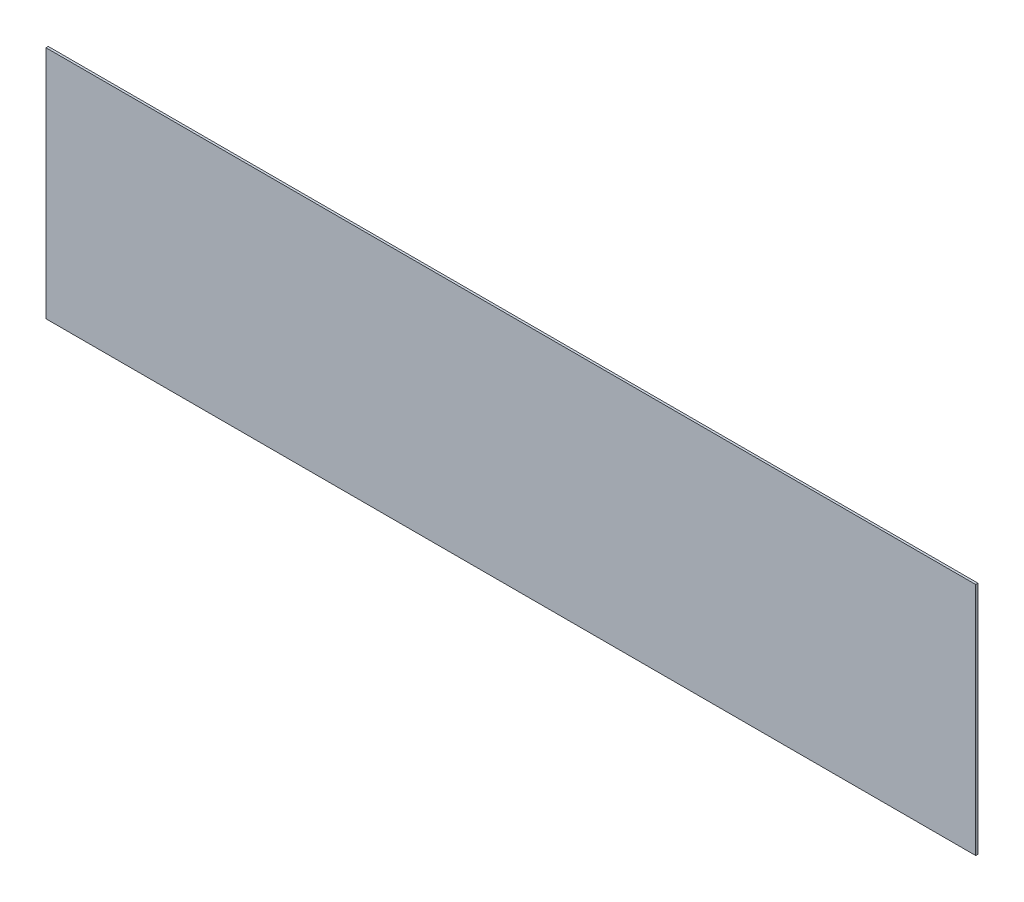
ISO-10303-21;
HEADER;
FILE_DESCRIPTION(('STEP AP214'),'2;1');
FILE_NAME('part.step','',(''),(''),'','','');
FILE_SCHEMA(('AUTOMOTIVE_DESIGN { 1 0 10303 214 1 1 1 1 }'));
ENDSEC;
DATA;
#1=APPLICATION_CONTEXT('core data for automotive mechanical design processes');
#2=APPLICATION_PROTOCOL_DEFINITION('international standard','automotive_design',2000,#1);
#3=PRODUCT_CONTEXT('',#1,'mechanical');
#4=PRODUCT('Part','Part','',(#3));
#5=PRODUCT_RELATED_PRODUCT_CATEGORY('part','',(#4));
#6=PRODUCT_DEFINITION_FORMATION('','',#4);
#7=PRODUCT_DEFINITION_CONTEXT('part definition',#1,'design');
#8=PRODUCT_DEFINITION('design','',#6,#7);
#9=PRODUCT_DEFINITION_SHAPE('','',#8);
#10=(LENGTH_UNIT() NAMED_UNIT(*) SI_UNIT(.MILLI.,.METRE.));
#11=(NAMED_UNIT(*) PLANE_ANGLE_UNIT() SI_UNIT($,.RADIAN.));
#12=(NAMED_UNIT(*) SI_UNIT($,.STERADIAN.) SOLID_ANGLE_UNIT());
#13=UNCERTAINTY_MEASURE_WITH_UNIT(LENGTH_MEASURE(1.E-05),#10,'distance_accuracy_value','');
#14=(GEOMETRIC_REPRESENTATION_CONTEXT(3) GLOBAL_UNCERTAINTY_ASSIGNED_CONTEXT((#13)) GLOBAL_UNIT_ASSIGNED_CONTEXT((#10,
#11,#12)) REPRESENTATION_CONTEXT('',''));
#15=CARTESIAN_POINT('',(0.,0.,0.));
#16=DIRECTION('',(0.,0.,1.));
#17=DIRECTION('',(1.,0.,0.));
#18=AXIS2_PLACEMENT_3D('',#15,#16,#17);
#19=CARTESIAN_POINT('',(0.,0.,0.5));
#20=DIRECTION('',(1.,0.,0.));
#21=DIRECTION('',(0.,0.,-1.));
#22=AXIS2_PLACEMENT_3D('',#19,#20,#21);
#23=PLANE('',#22);
#24=DIRECTION('',(0.,-1.,0.));
#25=VECTOR('',#24,1.);
#26=CARTESIAN_POINT('',(0.,0.,0.));
#27=LINE('',#26,#25);
#28=CARTESIAN_POINT('',(0.,51.308,0.));
#29=VERTEX_POINT('',#28);
#30=CARTESIAN_POINT('',(0.,0.,0.));
#31=VERTEX_POINT('',#30);
#32=EDGE_CURVE('E104',#29,#31,#27,.T.);
#33=ORIENTED_EDGE('',*,*,#32,.T.);
#34=DIRECTION('',(0.,0.,-1.));
#35=VECTOR('',#34,1.);
#36=CARTESIAN_POINT('',(0.,0.,0.5));
#37=LINE('',#36,#35);
#38=CARTESIAN_POINT('',(0.,0.,0.5));
#39=VERTEX_POINT('',#38);
#40=EDGE_CURVE('E11',#39,#31,#37,.T.);
#41=ORIENTED_EDGE('',*,*,#40,.F.);
#42=DIRECTION('',(0.,-1.,0.));
#43=VECTOR('',#42,1.);
#44=CARTESIAN_POINT('',(0.,0.,0.5));
#45=LINE('',#44,#43);
#46=CARTESIAN_POINT('',(0.,51.308,0.5));
#47=VERTEX_POINT('',#46);
#48=EDGE_CURVE('E92',#47,#39,#45,.T.);
#49=ORIENTED_EDGE('',*,*,#48,.F.);
#50=DIRECTION('',(0.,0.,-1.));
#51=VECTOR('',#50,1.);
#52=CARTESIAN_POINT('',(0.,51.308,0.5));
#53=LINE('',#52,#51);
#54=EDGE_CURVE('E100',#47,#29,#53,.T.);
#55=ORIENTED_EDGE('',*,*,#54,.T.);
#56=EDGE_LOOP('',(#33,#41,#49,#55));
#57=FACE_BOUND('',#56,.T.);
#58=ADVANCED_FACE('F41',(#57),#23,.F.);
#59=CARTESIAN_POINT('',(0.,0.,0.5));
#60=DIRECTION('',(0.,1.,0.));
#61=DIRECTION('',(0.,0.,1.));
#62=AXIS2_PLACEMENT_3D('',#59,#60,#61);
#63=PLANE('',#62);
#64=DIRECTION('',(1.,0.,0.));
#65=VECTOR('',#64,1.);
#66=CARTESIAN_POINT('',(0.,0.,0.));
#67=LINE('',#66,#65);
#68=CARTESIAN_POINT('',(203.2,0.,0.));
#69=VERTEX_POINT('',#68);
#70=EDGE_CURVE('E96',#31,#69,#67,.T.);
#71=ORIENTED_EDGE('',*,*,#70,.T.);
#72=DIRECTION('',(0.,0.,-1.));
#73=VECTOR('',#72,1.);
#74=CARTESIAN_POINT('',(203.2,0.,0.5));
#75=LINE('',#74,#73);
#76=CARTESIAN_POINT('',(203.2,0.,0.5));
#77=VERTEX_POINT('',#76);
#78=EDGE_CURVE('E49',#77,#69,#75,.T.);
#79=ORIENTED_EDGE('',*,*,#78,.F.);
#80=DIRECTION('',(1.,0.,0.));
#81=VECTOR('',#80,1.);
#82=CARTESIAN_POINT('',(0.,0.,0.5));
#83=LINE('',#82,#81);
#84=EDGE_CURVE('E87',#39,#77,#83,.T.);
#85=ORIENTED_EDGE('',*,*,#84,.F.);
#86=ORIENTED_EDGE('',*,*,#40,.T.);
#87=EDGE_LOOP('',(#71,#79,#85,#86));
#88=FACE_BOUND('',#87,.T.);
#89=ADVANCED_FACE('F95',(#88),#63,.F.);
#90=CARTESIAN_POINT('',(203.2,0.,0.5));
#91=DIRECTION('',(-1.,0.,0.));
#92=DIRECTION('',(0.,0.,1.));
#93=AXIS2_PLACEMENT_3D('',#90,#91,#92);
#94=PLANE('',#93);
#95=DIRECTION('',(0.,1.,0.));
#96=VECTOR('',#95,1.);
#97=CARTESIAN_POINT('',(203.2,0.,0.));
#98=LINE('',#97,#96);
#99=CARTESIAN_POINT('',(203.2,51.308,0.));
#100=VERTEX_POINT('',#99);
#101=EDGE_CURVE('E74',#69,#100,#98,.T.);
#102=ORIENTED_EDGE('',*,*,#101,.T.);
#103=DIRECTION('',(0.,0.,-1.));
#104=VECTOR('',#103,1.);
#105=CARTESIAN_POINT('',(203.2,51.308,0.5));
#106=LINE('',#105,#104);
#107=CARTESIAN_POINT('',(203.2,51.308,0.5));
#108=VERTEX_POINT('',#107);
#109=EDGE_CURVE('E97',#108,#100,#106,.T.);
#110=ORIENTED_EDGE('',*,*,#109,.F.);
#111=DIRECTION('',(0.,1.,0.));
#112=VECTOR('',#111,1.);
#113=CARTESIAN_POINT('',(203.2,0.,0.5));
#114=LINE('',#113,#112);
#115=EDGE_CURVE('E90',#77,#108,#114,.T.);
#116=ORIENTED_EDGE('',*,*,#115,.F.);
#117=ORIENTED_EDGE('',*,*,#78,.T.);
#118=EDGE_LOOP('',(#102,#110,#116,#117));
#119=FACE_BOUND('',#118,.T.);
#120=ADVANCED_FACE('F98',(#119),#94,.F.);
#121=CARTESIAN_POINT('',(0.,51.308,0.5));
#122=DIRECTION('',(0.,-1.,0.));
#123=DIRECTION('',(0.,0.,-1.));
#124=AXIS2_PLACEMENT_3D('',#121,#122,#123);
#125=PLANE('',#124);
#126=DIRECTION('',(-1.,0.,0.));
#127=VECTOR('',#126,1.);
#128=CARTESIAN_POINT('',(0.,51.308,0.));
#129=LINE('',#128,#127);
#130=EDGE_CURVE('E80',#100,#29,#129,.T.);
#131=ORIENTED_EDGE('',*,*,#130,.T.);
#132=ORIENTED_EDGE('',*,*,#54,.F.);
#133=DIRECTION('',(-1.,0.,0.));
#134=VECTOR('',#133,1.);
#135=CARTESIAN_POINT('',(0.,51.308,0.5));
#136=LINE('',#135,#134);
#137=EDGE_CURVE('E57',#108,#47,#136,.T.);
#138=ORIENTED_EDGE('',*,*,#137,.F.);
#139=ORIENTED_EDGE('',*,*,#109,.T.);
#140=EDGE_LOOP('',(#131,#132,#138,#139));
#141=FACE_BOUND('',#140,.T.);
#142=ADVANCED_FACE('F111',(#141),#125,.F.);
#143=CARTESIAN_POINT('',(0.,0.,0.5));
#144=DIRECTION('',(0.,0.,-1.));
#145=DIRECTION('',(-1.,0.,0.));
#146=AXIS2_PLACEMENT_3D('',#143,#144,#145);
#147=PLANE('',#146);
#148=ORIENTED_EDGE('',*,*,#48,.T.);
#149=ORIENTED_EDGE('',*,*,#84,.T.);
#150=ORIENTED_EDGE('',*,*,#115,.T.);
#151=ORIENTED_EDGE('',*,*,#137,.T.);
#152=EDGE_LOOP('',(#148,#149,#150,#151));
#153=FACE_BOUND('',#152,.T.);
#154=ADVANCED_FACE('F88',(#153),#147,.F.);
#155=CARTESIAN_POINT('',(0.,0.,0.));
#156=DIRECTION('',(0.,0.,-1.));
#157=DIRECTION('',(-1.,0.,0.));
#158=AXIS2_PLACEMENT_3D('',#155,#156,#157);
#159=PLANE('',#158);
#160=ORIENTED_EDGE('',*,*,#32,.F.);
#161=ORIENTED_EDGE('',*,*,#130,.F.);
#162=ORIENTED_EDGE('',*,*,#101,.F.);
#163=ORIENTED_EDGE('',*,*,#70,.F.);
#164=EDGE_LOOP('',(#160,#161,#162,#163));
#165=FACE_BOUND('',#164,.T.);
#166=ADVANCED_FACE('F114',(#165),#159,.T.);
#167=CLOSED_SHELL('',(#58,#89,#120,#142,#154,#166));
#168=MANIFOLD_SOLID_BREP('B2',#167);
#169=ADVANCED_BREP_SHAPE_REPRESENTATION('',(#18,#168),#14);
#170=SHAPE_DEFINITION_REPRESENTATION(#9,#169);
ENDSEC;
END-ISO-10303-21;
